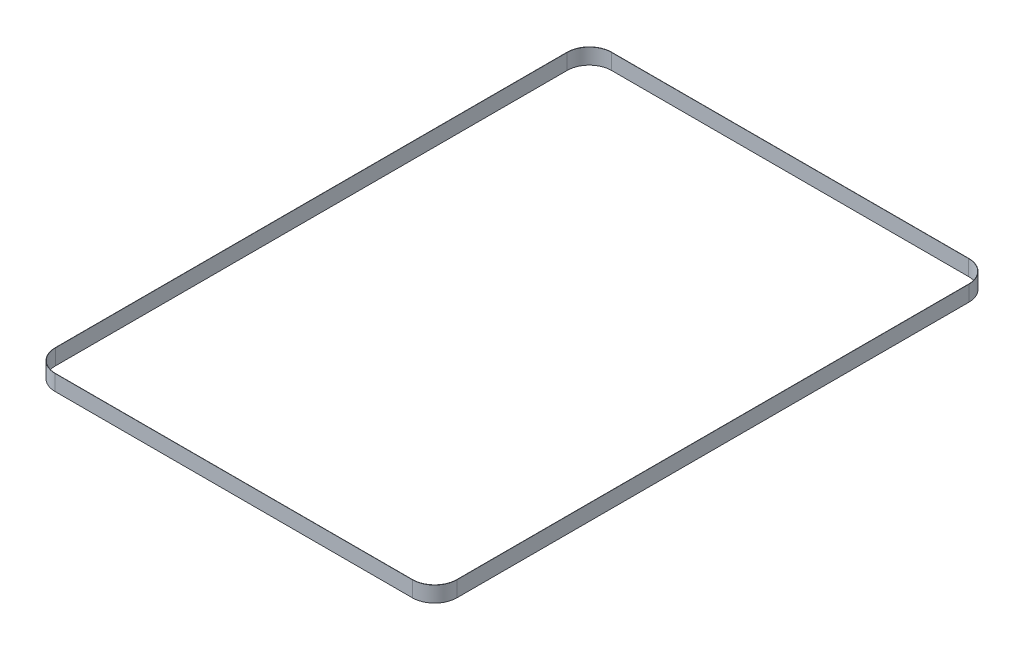
ISO-10303-21;
HEADER;
FILE_DESCRIPTION(('STEP AP214'),'2;1');
FILE_NAME('part.step','',(''),(''),'','','');
FILE_SCHEMA(('AUTOMOTIVE_DESIGN { 1 0 10303 214 1 1 1 1 }'));
ENDSEC;
DATA;
#1=APPLICATION_CONTEXT('core data for automotive mechanical design processes');
#2=APPLICATION_PROTOCOL_DEFINITION('international standard','automotive_design',2000,#1);
#3=PRODUCT_CONTEXT('',#1,'mechanical');
#4=PRODUCT('Part','Part','',(#3));
#5=PRODUCT_RELATED_PRODUCT_CATEGORY('part','',(#4));
#6=PRODUCT_DEFINITION_FORMATION('','',#4);
#7=PRODUCT_DEFINITION_CONTEXT('part definition',#1,'design');
#8=PRODUCT_DEFINITION('design','',#6,#7);
#9=PRODUCT_DEFINITION_SHAPE('','',#8);
#10=(LENGTH_UNIT() NAMED_UNIT(*) SI_UNIT(.MILLI.,.METRE.));
#11=(NAMED_UNIT(*) PLANE_ANGLE_UNIT() SI_UNIT($,.RADIAN.));
#12=(NAMED_UNIT(*) SI_UNIT($,.STERADIAN.) SOLID_ANGLE_UNIT());
#13=UNCERTAINTY_MEASURE_WITH_UNIT(LENGTH_MEASURE(1.E-05),#10,'distance_accuracy_value','');
#14=(GEOMETRIC_REPRESENTATION_CONTEXT(3) GLOBAL_UNCERTAINTY_ASSIGNED_CONTEXT((#13)) GLOBAL_UNIT_ASSIGNED_CONTEXT((#10,
#11,#12)) REPRESENTATION_CONTEXT('',''));
#15=CARTESIAN_POINT('',(0.,0.,0.));
#16=DIRECTION('',(0.,0.,1.));
#17=DIRECTION('',(1.,0.,0.));
#18=AXIS2_PLACEMENT_3D('',#15,#16,#17);
#19=CARTESIAN_POINT('',(-10.,7.,-10.));
#20=DIRECTION('',(0.,1.,0.));
#21=DIRECTION('',(0.,0.,1.));
#22=AXIS2_PLACEMENT_3D('',#19,#20,#21);
#23=PLANE('',#22);
#24=CARTESIAN_POINT('',(-10.,7.,-10.));
#25=DIRECTION('',(0.,1.,0.));
#26=DIRECTION('',(0.,0.,1.));
#27=AXIS2_PLACEMENT_3D('',#24,#25,#26);
#28=CIRCLE('',#27,10.);
#29=CARTESIAN_POINT('',(-10.0000000000001,7.,0.));
#30=VERTEX_POINT('',#29);
#31=CARTESIAN_POINT('',(0.,7.,-10.0000000000001));
#32=VERTEX_POINT('',#31);
#33=EDGE_CURVE('E242',#30,#32,#28,.T.);
#34=ORIENTED_EDGE('',*,*,#33,.T.);
#35=DIRECTION('',(0.,0.,-1.));
#36=VECTOR('',#35,1.);
#37=CARTESIAN_POINT('',(0.,7.,-10.0000000000001));
#38=LINE('',#37,#36);
#39=CARTESIAN_POINT('',(0.,7.,-238.6));
#40=VERTEX_POINT('',#39);
#41=EDGE_CURVE('E246',#32,#40,#38,.T.);
#42=ORIENTED_EDGE('',*,*,#41,.T.);
#43=CARTESIAN_POINT('',(-10.,7.,-238.6));
#44=DIRECTION('',(0.,1.,0.));
#45=DIRECTION('',(0.,0.,1.));
#46=AXIS2_PLACEMENT_3D('',#43,#44,#45);
#47=CIRCLE('',#46,10.);
#48=CARTESIAN_POINT('',(-10.0000000000001,7.,-248.6));
#49=VERTEX_POINT('',#48);
#50=EDGE_CURVE('E250',#40,#49,#47,.T.);
#51=ORIENTED_EDGE('',*,*,#50,.T.);
#52=DIRECTION('',(-1.,0.,0.));
#53=VECTOR('',#52,1.);
#54=CARTESIAN_POINT('',(-10.0000000000001,7.,-248.6));
#55=LINE('',#54,#53);
#56=CARTESIAN_POINT('',(-169.5,7.,-248.6));
#57=VERTEX_POINT('',#56);
#58=EDGE_CURVE('E253',#49,#57,#55,.T.);
#59=ORIENTED_EDGE('',*,*,#58,.T.);
#60=CARTESIAN_POINT('',(-169.5,7.,-238.6));
#61=DIRECTION('',(0.,1.,0.));
#62=DIRECTION('',(0.,0.,1.));
#63=AXIS2_PLACEMENT_3D('',#60,#61,#62);
#64=CIRCLE('',#63,10.);
#65=CARTESIAN_POINT('',(-179.5,7.,-238.6));
#66=VERTEX_POINT('',#65);
#67=EDGE_CURVE('E256',#57,#66,#64,.T.);
#68=ORIENTED_EDGE('',*,*,#67,.T.);
#69=DIRECTION('',(0.,0.,1.));
#70=VECTOR('',#69,1.);
#71=CARTESIAN_POINT('',(-179.5,7.,-10.0000000000001));
#72=LINE('',#71,#70);
#73=CARTESIAN_POINT('',(-179.5,7.,-10.0000000000001));
#74=VERTEX_POINT('',#73);
#75=EDGE_CURVE('E259',#66,#74,#72,.T.);
#76=ORIENTED_EDGE('',*,*,#75,.T.);
#77=CARTESIAN_POINT('',(-169.5,7.,-10.));
#78=DIRECTION('',(0.,1.,0.));
#79=DIRECTION('',(0.,0.,-1.));
#80=AXIS2_PLACEMENT_3D('',#77,#78,#79);
#81=CIRCLE('',#80,10.);
#82=CARTESIAN_POINT('',(-169.5,7.,0.));
#83=VERTEX_POINT('',#82);
#84=EDGE_CURVE('E262',#74,#83,#81,.T.);
#85=ORIENTED_EDGE('',*,*,#84,.T.);
#86=DIRECTION('',(1.,0.,0.));
#87=VECTOR('',#86,1.);
#88=CARTESIAN_POINT('',(-10.0000000000001,7.,0.));
#89=LINE('',#88,#87);
#90=EDGE_CURVE('E265',#83,#30,#89,.T.);
#91=ORIENTED_EDGE('',*,*,#90,.T.);
#92=EDGE_LOOP('',(#34,#42,#51,#59,#68,#76,#85,#91));
#93=FACE_BOUND('',#92,.T.);
#94=DIRECTION('',(0.,0.,-1.));
#95=VECTOR('',#94,1.);
#96=CARTESIAN_POINT('',(-0.1,7.,-10.0000000000001));
#97=LINE('',#96,#95);
#98=CARTESIAN_POINT('',(-0.1,7.,-10.0000000000001));
#99=VERTEX_POINT('',#98);
#100=CARTESIAN_POINT('',(-0.1,7.,-238.6));
#101=VERTEX_POINT('',#100);
#102=EDGE_CURVE('E162',#99,#101,#97,.T.);
#103=ORIENTED_EDGE('',*,*,#102,.F.);
#104=CARTESIAN_POINT('',(-10.,7.,-10.));
#105=DIRECTION('',(0.,1.,0.));
#106=DIRECTION('',(0.,0.,1.));
#107=AXIS2_PLACEMENT_3D('',#104,#105,#106);
#108=CIRCLE('',#107,9.9);
#109=CARTESIAN_POINT('',(-10.0000000000001,7.,-0.1));
#110=VERTEX_POINT('',#109);
#111=EDGE_CURVE('E153',#110,#99,#108,.T.);
#112=ORIENTED_EDGE('',*,*,#111,.F.);
#113=DIRECTION('',(1.,0.,0.));
#114=VECTOR('',#113,1.);
#115=CARTESIAN_POINT('',(-10.0000000000001,7.,-0.1));
#116=LINE('',#115,#114);
#117=CARTESIAN_POINT('',(-169.5,7.,-0.0999999999999936));
#118=VERTEX_POINT('',#117);
#119=EDGE_CURVE('E194',#118,#110,#116,.T.);
#120=ORIENTED_EDGE('',*,*,#119,.F.);
#121=CARTESIAN_POINT('',(-169.5,7.,-10.));
#122=DIRECTION('',(0.,1.,0.));
#123=DIRECTION('',(0.,0.,-1.));
#124=AXIS2_PLACEMENT_3D('',#121,#122,#123);
#125=CIRCLE('',#124,9.90000000000001);
#126=CARTESIAN_POINT('',(-179.4,7.,-10.0000000000001));
#127=VERTEX_POINT('',#126);
#128=EDGE_CURVE('E191',#127,#118,#125,.T.);
#129=ORIENTED_EDGE('',*,*,#128,.F.);
#130=DIRECTION('',(0.,0.,1.));
#131=VECTOR('',#130,1.);
#132=CARTESIAN_POINT('',(-179.4,7.,-10.0000000000001));
#133=LINE('',#132,#131);
#134=CARTESIAN_POINT('',(-179.4,7.,-238.6));
#135=VERTEX_POINT('',#134);
#136=EDGE_CURVE('E188',#135,#127,#133,.T.);
#137=ORIENTED_EDGE('',*,*,#136,.F.);
#138=CARTESIAN_POINT('',(-169.5,7.,-238.6));
#139=DIRECTION('',(0.,1.,0.));
#140=DIRECTION('',(0.,0.,1.));
#141=AXIS2_PLACEMENT_3D('',#138,#139,#140);
#142=CIRCLE('',#141,9.90000000000003);
#143=CARTESIAN_POINT('',(-169.5,7.,-248.5));
#144=VERTEX_POINT('',#143);
#145=EDGE_CURVE('E185',#144,#135,#142,.T.);
#146=ORIENTED_EDGE('',*,*,#145,.F.);
#147=DIRECTION('',(-1.,0.,0.));
#148=VECTOR('',#147,1.);
#149=CARTESIAN_POINT('',(-10.0000000000001,7.,-248.5));
#150=LINE('',#149,#148);
#151=CARTESIAN_POINT('',(-10.0000000000001,7.,-248.5));
#152=VERTEX_POINT('',#151);
#153=EDGE_CURVE('E180',#152,#144,#150,.T.);
#154=ORIENTED_EDGE('',*,*,#153,.F.);
#155=CARTESIAN_POINT('',(-10.,7.,-238.6));
#156=DIRECTION('',(0.,1.,0.));
#157=DIRECTION('',(0.,0.,1.));
#158=AXIS2_PLACEMENT_3D('',#155,#156,#157);
#159=CIRCLE('',#158,9.9);
#160=EDGE_CURVE('E176',#101,#152,#159,.T.);
#161=ORIENTED_EDGE('',*,*,#160,.F.);
#162=EDGE_LOOP('',(#103,#112,#120,#129,#137,#146,#154,#161));
#163=FACE_BOUND('',#162,.T.);
#164=ADVANCED_FACE('F39',(#93,#163),#23,.T.);
#165=CARTESIAN_POINT('',(-10.,0.,-10.));
#166=DIRECTION('',(0.,1.,0.));
#167=DIRECTION('',(0.,0.,1.));
#168=AXIS2_PLACEMENT_3D('',#165,#166,#167);
#169=PLANE('',#168);
#170=CARTESIAN_POINT('',(-10.,0.,-10.));
#171=DIRECTION('',(0.,1.,0.));
#172=DIRECTION('',(0.,0.,1.));
#173=AXIS2_PLACEMENT_3D('',#170,#171,#172);
#174=CIRCLE('',#173,10.);
#175=CARTESIAN_POINT('',(-10.0000000000001,0.,0.));
#176=VERTEX_POINT('',#175);
#177=CARTESIAN_POINT('',(0.,0.,-10.0000000000001));
#178=VERTEX_POINT('',#177);
#179=EDGE_CURVE('E171',#176,#178,#174,.T.);
#180=ORIENTED_EDGE('',*,*,#179,.F.);
#181=DIRECTION('',(1.,0.,0.));
#182=VECTOR('',#181,1.);
#183=CARTESIAN_POINT('',(-10.0000000000001,0.,0.));
#184=LINE('',#183,#182);
#185=CARTESIAN_POINT('',(-169.5,0.,0.));
#186=VERTEX_POINT('',#185);
#187=EDGE_CURVE('E247',#186,#176,#184,.T.);
#188=ORIENTED_EDGE('',*,*,#187,.F.);
#189=CARTESIAN_POINT('',(-169.5,0.,-10.));
#190=DIRECTION('',(0.,1.,0.));
#191=DIRECTION('',(0.,0.,-1.));
#192=AXIS2_PLACEMENT_3D('',#189,#190,#191);
#193=CIRCLE('',#192,10.);
#194=CARTESIAN_POINT('',(-179.5,0.,-10.0000000000001));
#195=VERTEX_POINT('',#194);
#196=EDGE_CURVE('E287',#195,#186,#193,.T.);
#197=ORIENTED_EDGE('',*,*,#196,.F.);
#198=DIRECTION('',(0.,0.,1.));
#199=VECTOR('',#198,1.);
#200=CARTESIAN_POINT('',(-179.5,0.,-10.0000000000001));
#201=LINE('',#200,#199);
#202=CARTESIAN_POINT('',(-179.5,0.,-238.6));
#203=VERTEX_POINT('',#202);
#204=EDGE_CURVE('E284',#203,#195,#201,.T.);
#205=ORIENTED_EDGE('',*,*,#204,.F.);
#206=CARTESIAN_POINT('',(-169.5,0.,-238.6));
#207=DIRECTION('',(0.,1.,0.));
#208=DIRECTION('',(0.,0.,1.));
#209=AXIS2_PLACEMENT_3D('',#206,#207,#208);
#210=CIRCLE('',#209,10.);
#211=CARTESIAN_POINT('',(-169.5,0.,-248.6));
#212=VERTEX_POINT('',#211);
#213=EDGE_CURVE('E281',#212,#203,#210,.T.);
#214=ORIENTED_EDGE('',*,*,#213,.F.);
#215=DIRECTION('',(-1.,0.,0.));
#216=VECTOR('',#215,1.);
#217=CARTESIAN_POINT('',(-10.0000000000001,0.,-248.6));
#218=LINE('',#217,#216);
#219=CARTESIAN_POINT('',(-10.0000000000001,0.,-248.6));
#220=VERTEX_POINT('',#219);
#221=EDGE_CURVE('E278',#220,#212,#218,.T.);
#222=ORIENTED_EDGE('',*,*,#221,.F.);
#223=CARTESIAN_POINT('',(-10.,0.,-238.6));
#224=DIRECTION('',(0.,1.,0.));
#225=DIRECTION('',(0.,0.,1.));
#226=AXIS2_PLACEMENT_3D('',#223,#224,#225);
#227=CIRCLE('',#226,10.);
#228=CARTESIAN_POINT('',(0.,0.,-238.6));
#229=VERTEX_POINT('',#228);
#230=EDGE_CURVE('E275',#229,#220,#227,.T.);
#231=ORIENTED_EDGE('',*,*,#230,.F.);
#232=DIRECTION('',(0.,0.,-1.));
#233=VECTOR('',#232,1.);
#234=CARTESIAN_POINT('',(0.,0.,-10.0000000000001));
#235=LINE('',#234,#233);
#236=EDGE_CURVE('E272',#178,#229,#235,.T.);
#237=ORIENTED_EDGE('',*,*,#236,.F.);
#238=EDGE_LOOP('',(#180,#188,#197,#205,#214,#222,#231,#237));
#239=FACE_BOUND('',#238,.T.);
#240=CARTESIAN_POINT('',(-10.,0.,-10.));
#241=DIRECTION('',(0.,1.,0.));
#242=DIRECTION('',(0.,0.,1.));
#243=AXIS2_PLACEMENT_3D('',#240,#241,#242);
#244=CIRCLE('',#243,9.9);
#245=CARTESIAN_POINT('',(-10.0000000000001,0.,-0.0999999999999994));
#246=VERTEX_POINT('',#245);
#247=CARTESIAN_POINT('',(-0.1,0.,-10.0000000000001));
#248=VERTEX_POINT('',#247);
#249=EDGE_CURVE('E63',#246,#248,#244,.T.);
#250=ORIENTED_EDGE('',*,*,#249,.T.);
#251=DIRECTION('',(0.,0.,-1.));
#252=VECTOR('',#251,1.);
#253=CARTESIAN_POINT('',(-0.1,0.,-10.0000000000001));
#254=LINE('',#253,#252);
#255=CARTESIAN_POINT('',(-0.1,0.,-238.6));
#256=VERTEX_POINT('',#255);
#257=EDGE_CURVE('E169',#248,#256,#254,.T.);
#258=ORIENTED_EDGE('',*,*,#257,.T.);
#259=CARTESIAN_POINT('',(-10.,0.,-238.6));
#260=DIRECTION('',(0.,1.,0.));
#261=DIRECTION('',(0.,0.,1.));
#262=AXIS2_PLACEMENT_3D('',#259,#260,#261);
#263=CIRCLE('',#262,9.9);
#264=CARTESIAN_POINT('',(-10.0000000000001,0.,-248.5));
#265=VERTEX_POINT('',#264);
#266=EDGE_CURVE('E201',#256,#265,#263,.T.);
#267=ORIENTED_EDGE('',*,*,#266,.T.);
#268=DIRECTION('',(-1.,0.,0.));
#269=VECTOR('',#268,1.);
#270=CARTESIAN_POINT('',(-10.0000000000001,0.,-248.5));
#271=LINE('',#270,#269);
#272=CARTESIAN_POINT('',(-169.5,0.,-248.5));
#273=VERTEX_POINT('',#272);
#274=EDGE_CURVE('E205',#265,#273,#271,.T.);
#275=ORIENTED_EDGE('',*,*,#274,.T.);
#276=CARTESIAN_POINT('',(-169.5,0.,-238.6));
#277=DIRECTION('',(0.,1.,0.));
#278=DIRECTION('',(0.,0.,1.));
#279=AXIS2_PLACEMENT_3D('',#276,#277,#278);
#280=CIRCLE('',#279,9.90000000000003);
#281=CARTESIAN_POINT('',(-179.4,0.,-238.6));
#282=VERTEX_POINT('',#281);
#283=EDGE_CURVE('E209',#273,#282,#280,.T.);
#284=ORIENTED_EDGE('',*,*,#283,.T.);
#285=DIRECTION('',(0.,0.,1.));
#286=VECTOR('',#285,1.);
#287=CARTESIAN_POINT('',(-179.4,0.,-10.0000000000001));
#288=LINE('',#287,#286);
#289=CARTESIAN_POINT('',(-179.4,0.,-10.0000000000001));
#290=VERTEX_POINT('',#289);
#291=EDGE_CURVE('E213',#282,#290,#288,.T.);
#292=ORIENTED_EDGE('',*,*,#291,.T.);
#293=CARTESIAN_POINT('',(-169.5,0.,-10.));
#294=DIRECTION('',(0.,1.,0.));
#295=DIRECTION('',(0.,0.,-1.));
#296=AXIS2_PLACEMENT_3D('',#293,#294,#295);
#297=CIRCLE('',#296,9.90000000000001);
#298=CARTESIAN_POINT('',(-169.5,0.,-0.0999999999999855));
#299=VERTEX_POINT('',#298);
#300=EDGE_CURVE('E217',#290,#299,#297,.T.);
#301=ORIENTED_EDGE('',*,*,#300,.T.);
#302=DIRECTION('',(1.,0.,0.));
#303=VECTOR('',#302,1.);
#304=CARTESIAN_POINT('',(-10.0000000000001,0.,-0.1));
#305=LINE('',#304,#303);
#306=EDGE_CURVE('E163',#299,#246,#305,.T.);
#307=ORIENTED_EDGE('',*,*,#306,.T.);
#308=EDGE_LOOP('',(#250,#258,#267,#275,#284,#292,#301,#307));
#309=FACE_BOUND('',#308,.T.);
#310=ADVANCED_FACE('F326',(#239,#309),#169,.F.);
#311=CARTESIAN_POINT('',(-10.,7.,-10.));
#312=DIRECTION('',(0.,-1.,0.));
#313=DIRECTION('',(0.,0.,-1.));
#314=AXIS2_PLACEMENT_3D('',#311,#312,#313);
#315=CYLINDRICAL_SURFACE('',#314,10.);
#316=ORIENTED_EDGE('',*,*,#179,.T.);
#317=DIRECTION('',(0.,-1.,0.));
#318=VECTOR('',#317,1.);
#319=CARTESIAN_POINT('',(0.,7.,-10.0000000000001));
#320=LINE('',#319,#318);
#321=EDGE_CURVE('E11',#32,#178,#320,.T.);
#322=ORIENTED_EDGE('',*,*,#321,.F.);
#323=ORIENTED_EDGE('',*,*,#33,.F.);
#324=DIRECTION('',(0.,-1.,0.));
#325=VECTOR('',#324,1.);
#326=CARTESIAN_POINT('',(-10.0000000000001,7.,0.));
#327=LINE('',#326,#325);
#328=EDGE_CURVE('E268',#30,#176,#327,.T.);
#329=ORIENTED_EDGE('',*,*,#328,.T.);
#330=EDGE_LOOP('',(#316,#322,#323,#329));
#331=FACE_BOUND('',#330,.T.);
#332=ADVANCED_FACE('F41',(#331),#315,.T.);
#333=CARTESIAN_POINT('',(0.,7.,-10.0000000000001));
#334=DIRECTION('',(-1.,0.,0.));
#335=DIRECTION('',(0.,0.,1.));
#336=AXIS2_PLACEMENT_3D('',#333,#334,#335);
#337=PLANE('',#336);
#338=ORIENTED_EDGE('',*,*,#236,.T.);
#339=DIRECTION('',(0.,-1.,0.));
#340=VECTOR('',#339,1.);
#341=CARTESIAN_POINT('',(0.,7.,-238.6));
#342=LINE('',#341,#340);
#343=EDGE_CURVE('E48',#40,#229,#342,.T.);
#344=ORIENTED_EDGE('',*,*,#343,.F.);
#345=ORIENTED_EDGE('',*,*,#41,.F.);
#346=ORIENTED_EDGE('',*,*,#321,.T.);
#347=EDGE_LOOP('',(#338,#344,#345,#346));
#348=FACE_BOUND('',#347,.T.);
#349=ADVANCED_FACE('F343',(#348),#337,.F.);
#350=CARTESIAN_POINT('',(-10.,7.,-238.6));
#351=DIRECTION('',(0.,-1.,0.));
#352=DIRECTION('',(0.,0.,-1.));
#353=AXIS2_PLACEMENT_3D('',#350,#351,#352);
#354=CYLINDRICAL_SURFACE('',#353,10.);
#355=ORIENTED_EDGE('',*,*,#230,.T.);
#356=DIRECTION('',(0.,-1.,0.));
#357=VECTOR('',#356,1.);
#358=CARTESIAN_POINT('',(-10.0000000000001,7.,-248.6));
#359=LINE('',#358,#357);
#360=EDGE_CURVE('E311',#49,#220,#359,.T.);
#361=ORIENTED_EDGE('',*,*,#360,.F.);
#362=ORIENTED_EDGE('',*,*,#50,.F.);
#363=ORIENTED_EDGE('',*,*,#343,.T.);
#364=EDGE_LOOP('',(#355,#361,#362,#363));
#365=FACE_BOUND('',#364,.T.);
#366=ADVANCED_FACE('F320',(#365),#354,.T.);
#367=CARTESIAN_POINT('',(-10.0000000000001,7.,-248.6));
#368=DIRECTION('',(0.,0.,1.));
#369=DIRECTION('',(1.,0.,0.));
#370=AXIS2_PLACEMENT_3D('',#367,#368,#369);
#371=PLANE('',#370);
#372=ORIENTED_EDGE('',*,*,#221,.T.);
#373=DIRECTION('',(0.,-1.,0.));
#374=VECTOR('',#373,1.);
#375=CARTESIAN_POINT('',(-169.5,7.,-248.6));
#376=LINE('',#375,#374);
#377=EDGE_CURVE('E307',#57,#212,#376,.T.);
#378=ORIENTED_EDGE('',*,*,#377,.F.);
#379=ORIENTED_EDGE('',*,*,#58,.F.);
#380=ORIENTED_EDGE('',*,*,#360,.T.);
#381=EDGE_LOOP('',(#372,#378,#379,#380));
#382=FACE_BOUND('',#381,.T.);
#383=ADVANCED_FACE('F332',(#382),#371,.F.);
#384=CARTESIAN_POINT('',(-169.5,7.,-238.6));
#385=DIRECTION('',(0.,-1.,0.));
#386=DIRECTION('',(0.,0.,-1.));
#387=AXIS2_PLACEMENT_3D('',#384,#385,#386);
#388=CYLINDRICAL_SURFACE('',#387,10.);
#389=ORIENTED_EDGE('',*,*,#213,.T.);
#390=DIRECTION('',(0.,-1.,0.));
#391=VECTOR('',#390,1.);
#392=CARTESIAN_POINT('',(-179.5,7.,-238.6));
#393=LINE('',#392,#391);
#394=EDGE_CURVE('E303',#66,#203,#393,.T.);
#395=ORIENTED_EDGE('',*,*,#394,.F.);
#396=ORIENTED_EDGE('',*,*,#67,.F.);
#397=ORIENTED_EDGE('',*,*,#377,.T.);
#398=EDGE_LOOP('',(#389,#395,#396,#397));
#399=FACE_BOUND('',#398,.T.);
#400=ADVANCED_FACE('F336',(#399),#388,.T.);
#401=CARTESIAN_POINT('',(-179.5,7.,-10.0000000000001));
#402=DIRECTION('',(1.,0.,0.));
#403=DIRECTION('',(0.,0.,-1.));
#404=AXIS2_PLACEMENT_3D('',#401,#402,#403);
#405=PLANE('',#404);
#406=ORIENTED_EDGE('',*,*,#204,.T.);
#407=DIRECTION('',(0.,-1.,0.));
#408=VECTOR('',#407,1.);
#409=CARTESIAN_POINT('',(-179.5,7.,-10.0000000000001));
#410=LINE('',#409,#408);
#411=EDGE_CURVE('E299',#74,#195,#410,.T.);
#412=ORIENTED_EDGE('',*,*,#411,.F.);
#413=ORIENTED_EDGE('',*,*,#75,.F.);
#414=ORIENTED_EDGE('',*,*,#394,.T.);
#415=EDGE_LOOP('',(#406,#412,#413,#414));
#416=FACE_BOUND('',#415,.T.);
#417=ADVANCED_FACE('F356',(#416),#405,.F.);
#418=CARTESIAN_POINT('',(-169.5,7.,-10.));
#419=DIRECTION('',(0.,-1.,0.));
#420=DIRECTION('',(0.,0.,-1.));
#421=AXIS2_PLACEMENT_3D('',#418,#419,#420);
#422=CYLINDRICAL_SURFACE('',#421,10.);
#423=ORIENTED_EDGE('',*,*,#196,.T.);
#424=DIRECTION('',(0.,-1.,0.));
#425=VECTOR('',#424,1.);
#426=CARTESIAN_POINT('',(-169.5,7.,0.));
#427=LINE('',#426,#425);
#428=EDGE_CURVE('E295',#83,#186,#427,.T.);
#429=ORIENTED_EDGE('',*,*,#428,.F.);
#430=ORIENTED_EDGE('',*,*,#84,.F.);
#431=ORIENTED_EDGE('',*,*,#411,.T.);
#432=EDGE_LOOP('',(#423,#429,#430,#431));
#433=FACE_BOUND('',#432,.T.);
#434=ADVANCED_FACE('F354',(#433),#422,.T.);
#435=CARTESIAN_POINT('',(-10.0000000000001,7.,0.));
#436=DIRECTION('',(0.,0.,-1.));
#437=DIRECTION('',(-1.,0.,0.));
#438=AXIS2_PLACEMENT_3D('',#435,#436,#437);
#439=PLANE('',#438);
#440=ORIENTED_EDGE('',*,*,#187,.T.);
#441=ORIENTED_EDGE('',*,*,#328,.F.);
#442=ORIENTED_EDGE('',*,*,#90,.F.);
#443=ORIENTED_EDGE('',*,*,#428,.T.);
#444=EDGE_LOOP('',(#440,#441,#442,#443));
#445=FACE_BOUND('',#444,.T.);
#446=ADVANCED_FACE('F349',(#445),#439,.F.);
#447=CARTESIAN_POINT('',(-10.,7.,-10.));
#448=DIRECTION('',(0.,-1.,0.));
#449=DIRECTION('',(0.,0.,-1.));
#450=AXIS2_PLACEMENT_3D('',#447,#448,#449);
#451=CYLINDRICAL_SURFACE('',#450,9.9);
#452=ORIENTED_EDGE('',*,*,#249,.F.);
#453=DIRECTION('',(0.,-1.,0.));
#454=VECTOR('',#453,1.);
#455=CARTESIAN_POINT('',(-10.0000000000001,7.,-0.1));
#456=LINE('',#455,#454);
#457=EDGE_CURVE('E157',#110,#246,#456,.T.);
#458=ORIENTED_EDGE('',*,*,#457,.F.);
#459=ORIENTED_EDGE('',*,*,#111,.T.);
#460=DIRECTION('',(0.,-1.,0.));
#461=VECTOR('',#460,1.);
#462=CARTESIAN_POINT('',(-0.1,7.,-10.0000000000001));
#463=LINE('',#462,#461);
#464=EDGE_CURVE('E156',#99,#248,#463,.T.);
#465=ORIENTED_EDGE('',*,*,#464,.T.);
#466=EDGE_LOOP('',(#452,#458,#459,#465));
#467=FACE_BOUND('',#466,.T.);
#468=ADVANCED_FACE('F155',(#467),#451,.F.);
#469=CARTESIAN_POINT('',(-0.1,7.,-10.0000000000001));
#470=DIRECTION('',(-1.,0.,0.));
#471=DIRECTION('',(0.,0.,1.));
#472=AXIS2_PLACEMENT_3D('',#469,#470,#471);
#473=PLANE('',#472);
#474=ORIENTED_EDGE('',*,*,#257,.F.);
#475=ORIENTED_EDGE('',*,*,#464,.F.);
#476=ORIENTED_EDGE('',*,*,#102,.T.);
#477=DIRECTION('',(0.,-1.,0.));
#478=VECTOR('',#477,1.);
#479=CARTESIAN_POINT('',(-0.1,7.,-238.6));
#480=LINE('',#479,#478);
#481=EDGE_CURVE('E172',#101,#256,#480,.T.);
#482=ORIENTED_EDGE('',*,*,#481,.T.);
#483=EDGE_LOOP('',(#474,#475,#476,#482));
#484=FACE_BOUND('',#483,.T.);
#485=ADVANCED_FACE('F166',(#484),#473,.T.);
#486=CARTESIAN_POINT('',(-10.,7.,-238.6));
#487=DIRECTION('',(0.,-1.,0.));
#488=DIRECTION('',(0.,0.,-1.));
#489=AXIS2_PLACEMENT_3D('',#486,#487,#488);
#490=CYLINDRICAL_SURFACE('',#489,9.9);
#491=ORIENTED_EDGE('',*,*,#266,.F.);
#492=ORIENTED_EDGE('',*,*,#481,.F.);
#493=ORIENTED_EDGE('',*,*,#160,.T.);
#494=DIRECTION('',(0.,-1.,0.));
#495=VECTOR('',#494,1.);
#496=CARTESIAN_POINT('',(-10.0000000000001,7.,-248.5));
#497=LINE('',#496,#495);
#498=EDGE_CURVE('E237',#152,#265,#497,.T.);
#499=ORIENTED_EDGE('',*,*,#498,.T.);
#500=EDGE_LOOP('',(#491,#492,#493,#499));
#501=FACE_BOUND('',#500,.T.);
#502=ADVANCED_FACE('F381',(#501),#490,.F.);
#503=CARTESIAN_POINT('',(-10.0000000000001,7.,-248.5));
#504=DIRECTION('',(0.,0.,1.));
#505=DIRECTION('',(1.,0.,0.));
#506=AXIS2_PLACEMENT_3D('',#503,#504,#505);
#507=PLANE('',#506);
#508=ORIENTED_EDGE('',*,*,#274,.F.);
#509=ORIENTED_EDGE('',*,*,#498,.F.);
#510=ORIENTED_EDGE('',*,*,#153,.T.);
#511=DIRECTION('',(0.,-1.,0.));
#512=VECTOR('',#511,1.);
#513=CARTESIAN_POINT('',(-169.5,7.,-248.5));
#514=LINE('',#513,#512);
#515=EDGE_CURVE('E234',#144,#273,#514,.T.);
#516=ORIENTED_EDGE('',*,*,#515,.T.);
#517=EDGE_LOOP('',(#508,#509,#510,#516));
#518=FACE_BOUND('',#517,.T.);
#519=ADVANCED_FACE('F385',(#518),#507,.T.);
#520=CARTESIAN_POINT('',(-169.5,7.,-238.6));
#521=DIRECTION('',(0.,-1.,0.));
#522=DIRECTION('',(0.,0.,-1.));
#523=AXIS2_PLACEMENT_3D('',#520,#521,#522);
#524=CYLINDRICAL_SURFACE('',#523,9.90000000000003);
#525=ORIENTED_EDGE('',*,*,#283,.F.);
#526=ORIENTED_EDGE('',*,*,#515,.F.);
#527=ORIENTED_EDGE('',*,*,#145,.T.);
#528=DIRECTION('',(0.,-1.,0.));
#529=VECTOR('',#528,1.);
#530=CARTESIAN_POINT('',(-179.4,7.,-238.6));
#531=LINE('',#530,#529);
#532=EDGE_CURVE('E231',#135,#282,#531,.T.);
#533=ORIENTED_EDGE('',*,*,#532,.T.);
#534=EDGE_LOOP('',(#525,#526,#527,#533));
#535=FACE_BOUND('',#534,.T.);
#536=ADVANCED_FACE('F391',(#535),#524,.F.);
#537=CARTESIAN_POINT('',(-179.4,7.,-10.0000000000001));
#538=DIRECTION('',(1.,0.,0.));
#539=DIRECTION('',(0.,0.,-1.));
#540=AXIS2_PLACEMENT_3D('',#537,#538,#539);
#541=PLANE('',#540);
#542=ORIENTED_EDGE('',*,*,#291,.F.);
#543=ORIENTED_EDGE('',*,*,#532,.F.);
#544=ORIENTED_EDGE('',*,*,#136,.T.);
#545=DIRECTION('',(0.,-1.,0.));
#546=VECTOR('',#545,1.);
#547=CARTESIAN_POINT('',(-179.4,7.,-10.0000000000001));
#548=LINE('',#547,#546);
#549=EDGE_CURVE('E228',#127,#290,#548,.T.);
#550=ORIENTED_EDGE('',*,*,#549,.T.);
#551=EDGE_LOOP('',(#542,#543,#544,#550));
#552=FACE_BOUND('',#551,.T.);
#553=ADVANCED_FACE('F395',(#552),#541,.T.);
#554=CARTESIAN_POINT('',(-169.5,7.,-10.));
#555=DIRECTION('',(0.,-1.,0.));
#556=DIRECTION('',(0.,0.,-1.));
#557=AXIS2_PLACEMENT_3D('',#554,#555,#556);
#558=CYLINDRICAL_SURFACE('',#557,9.90000000000001);
#559=ORIENTED_EDGE('',*,*,#300,.F.);
#560=ORIENTED_EDGE('',*,*,#549,.F.);
#561=ORIENTED_EDGE('',*,*,#128,.T.);
#562=DIRECTION('',(0.,-1.,0.));
#563=VECTOR('',#562,1.);
#564=CARTESIAN_POINT('',(-169.5,7.,-0.0999999999999855));
#565=LINE('',#564,#563);
#566=EDGE_CURVE('E55',#118,#299,#565,.T.);
#567=ORIENTED_EDGE('',*,*,#566,.T.);
#568=EDGE_LOOP('',(#559,#560,#561,#567));
#569=FACE_BOUND('',#568,.T.);
#570=ADVANCED_FACE('F399',(#569),#558,.F.);
#571=CARTESIAN_POINT('',(-10.0000000000001,7.,-0.1));
#572=DIRECTION('',(0.,0.,-1.));
#573=DIRECTION('',(-1.,0.,0.));
#574=AXIS2_PLACEMENT_3D('',#571,#572,#573);
#575=PLANE('',#574);
#576=ORIENTED_EDGE('',*,*,#306,.F.);
#577=ORIENTED_EDGE('',*,*,#566,.F.);
#578=ORIENTED_EDGE('',*,*,#119,.T.);
#579=ORIENTED_EDGE('',*,*,#457,.T.);
#580=EDGE_LOOP('',(#576,#577,#578,#579));
#581=FACE_BOUND('',#580,.T.);
#582=ADVANCED_FACE('F403',(#581),#575,.T.);
#583=CLOSED_SHELL('',(#164,#310,#332,#349,#366,#383,#400,#417,#434,#446,#468,#485,#502,#519,
#536,#553,#570,#582));
#584=MANIFOLD_SOLID_BREP('B2',#583);
#585=ADVANCED_BREP_SHAPE_REPRESENTATION('',(#18,#584),#14);
#586=SHAPE_DEFINITION_REPRESENTATION(#9,#585);
ENDSEC;
END-ISO-10303-21;
